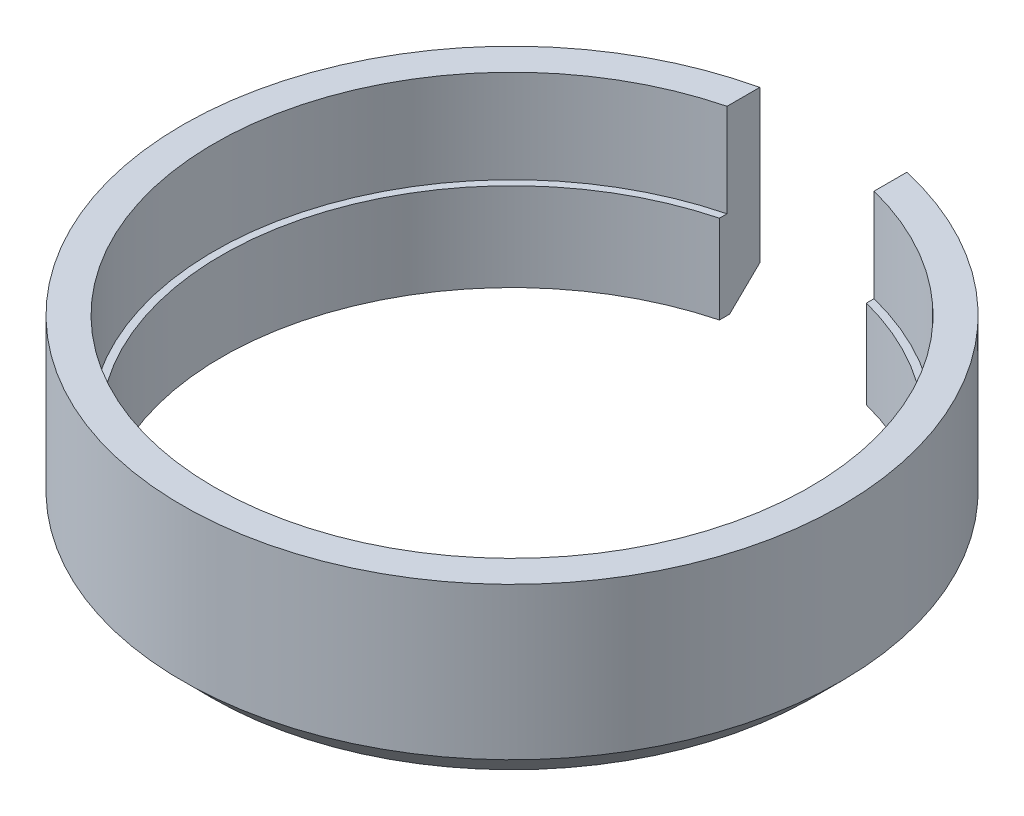
ISO-10303-21;
HEADER;
FILE_DESCRIPTION(('STEP AP214'),'2;1');
FILE_NAME('part.step','',(''),(''),'','','');
FILE_SCHEMA(('AUTOMOTIVE_DESIGN { 1 0 10303 214 1 1 1 1 }'));
ENDSEC;
DATA;
#1=APPLICATION_CONTEXT('core data for automotive mechanical design processes');
#2=APPLICATION_PROTOCOL_DEFINITION('international standard','automotive_design',2000,#1);
#3=PRODUCT_CONTEXT('',#1,'mechanical');
#4=PRODUCT('Part','Part','',(#3));
#5=PRODUCT_RELATED_PRODUCT_CATEGORY('part','',(#4));
#6=PRODUCT_DEFINITION_FORMATION('','',#4);
#7=PRODUCT_DEFINITION_CONTEXT('part definition',#1,'design');
#8=PRODUCT_DEFINITION('design','',#6,#7);
#9=PRODUCT_DEFINITION_SHAPE('','',#8);
#10=(LENGTH_UNIT() NAMED_UNIT(*) SI_UNIT(.MILLI.,.METRE.));
#11=(NAMED_UNIT(*) PLANE_ANGLE_UNIT() SI_UNIT($,.RADIAN.));
#12=(NAMED_UNIT(*) SI_UNIT($,.STERADIAN.) SOLID_ANGLE_UNIT());
#13=UNCERTAINTY_MEASURE_WITH_UNIT(LENGTH_MEASURE(1.E-05),#10,'distance_accuracy_value','');
#14=(GEOMETRIC_REPRESENTATION_CONTEXT(3) GLOBAL_UNCERTAINTY_ASSIGNED_CONTEXT((#13)) GLOBAL_UNIT_ASSIGNED_CONTEXT((#10,
#11,#12)) REPRESENTATION_CONTEXT('',''));
#15=CARTESIAN_POINT('',(0.,0.,0.));
#16=DIRECTION('',(0.,0.,1.));
#17=DIRECTION('',(1.,0.,0.));
#18=AXIS2_PLACEMENT_3D('',#15,#16,#17);
#19=CARTESIAN_POINT('',(0.,0.,0.));
#20=DIRECTION('',(0.,-1.,0.));
#21=DIRECTION('',(0.,0.,-1.));
#22=AXIS2_PLACEMENT_3D('',#19,#20,#21);
#23=CYLINDRICAL_SURFACE('',#22,11.85);
#24=CARTESIAN_POINT('',(0.,0.,0.));
#25=DIRECTION('',(0.,-1.,0.));
#26=DIRECTION('',(0.,0.,-1.));
#27=AXIS2_PLACEMENT_3D('',#24,#25,#26);
#28=CIRCLE('',#27,11.85);
#29=CARTESIAN_POINT('',(3.,0.,-11.4639652825713));
#30=VERTEX_POINT('',#29);
#31=CARTESIAN_POINT('',(-3.,0.,-11.4639652825713));
#32=VERTEX_POINT('',#31);
#33=EDGE_CURVE('E122',#30,#32,#28,.T.);
#34=ORIENTED_EDGE('',*,*,#33,.T.);
#35=DIRECTION('',(0.,-1.,0.));
#36=VECTOR('',#35,1.);
#37=CARTESIAN_POINT('',(-3.,0.,-11.4639652825713));
#38=LINE('',#37,#36);
#39=CARTESIAN_POINT('',(-3.,3.6,-11.4639652825713));
#40=VERTEX_POINT('',#39);
#41=EDGE_CURVE('E106',#40,#32,#38,.T.);
#42=ORIENTED_EDGE('',*,*,#41,.F.);
#43=CARTESIAN_POINT('',(0.,3.6,0.));
#44=DIRECTION('',(0.,-1.,0.));
#45=DIRECTION('',(0.,0.,-1.));
#46=AXIS2_PLACEMENT_3D('',#43,#44,#45);
#47=CIRCLE('',#46,11.85);
#48=CARTESIAN_POINT('',(3.,3.6,-11.4639652825713));
#49=VERTEX_POINT('',#48);
#50=EDGE_CURVE('E124',#49,#40,#47,.T.);
#51=ORIENTED_EDGE('',*,*,#50,.F.);
#52=DIRECTION('',(0.,-1.,0.));
#53=VECTOR('',#52,1.);
#54=CARTESIAN_POINT('',(3.,0.,-11.4639652825713));
#55=LINE('',#54,#53);
#56=EDGE_CURVE('E170',#30,#49,#55,.F.);
#57=ORIENTED_EDGE('',*,*,#56,.F.);
#58=EDGE_LOOP('',(#34,#42,#51,#57));
#59=FACE_BOUND('',#58,.T.);
#60=ADVANCED_FACE('F36',(#59),#23,.F.);
#61=CARTESIAN_POINT('',(-11.85,0.,0.));
#62=DIRECTION('',(0.,1.,0.));
#63=DIRECTION('',(0.,0.,1.));
#64=AXIS2_PLACEMENT_3D('',#61,#62,#63);
#65=PLANE('',#64);
#66=CARTESIAN_POINT('',(0.,0.,0.));
#67=DIRECTION('',(0.,1.,0.));
#68=DIRECTION('',(0.,0.,1.));
#69=AXIS2_PLACEMENT_3D('',#66,#67,#68);
#70=CIRCLE('',#69,12.25);
#71=CARTESIAN_POINT('',(3.,0.,-11.8769735202197));
#72=VERTEX_POINT('',#71);
#73=CARTESIAN_POINT('',(-3.,0.,-11.8769735202197));
#74=VERTEX_POINT('',#73);
#75=EDGE_CURVE('E45',#72,#74,#70,.F.);
#76=ORIENTED_EDGE('',*,*,#75,.T.);
#77=DIRECTION('',(0.,0.,-1.));
#78=VECTOR('',#77,1.);
#79=CARTESIAN_POINT('',(-3.,0.,-17.));
#80=LINE('',#79,#78);
#81=EDGE_CURVE('E52',#32,#74,#80,.T.);
#82=ORIENTED_EDGE('',*,*,#81,.F.);
#83=ORIENTED_EDGE('',*,*,#33,.F.);
#84=DIRECTION('',(0.,0.,1.));
#85=VECTOR('',#84,1.);
#86=CARTESIAN_POINT('',(3.,0.,-17.));
#87=LINE('',#86,#85);
#88=EDGE_CURVE('E135',#72,#30,#87,.T.);
#89=ORIENTED_EDGE('',*,*,#88,.F.);
#90=EDGE_LOOP('',(#76,#82,#83,#89));
#91=FACE_BOUND('',#90,.T.);
#92=ADVANCED_FACE('F133',(#91),#65,.F.);
#93=CARTESIAN_POINT('',(0.,0.,0.));
#94=DIRECTION('',(0.,-1.,0.));
#95=DIRECTION('',(0.,0.,-1.));
#96=AXIS2_PLACEMENT_3D('',#93,#94,#95);
#97=CYLINDRICAL_SURFACE('',#96,13.45);
#98=CARTESIAN_POINT('',(0.,7.4,0.));
#99=DIRECTION('',(0.,-1.,0.));
#100=DIRECTION('',(0.,0.,-1.));
#101=AXIS2_PLACEMENT_3D('',#98,#99,#100);
#102=CIRCLE('',#101,13.45);
#103=CARTESIAN_POINT('',(3.,7.4,-13.1111593690261));
#104=VERTEX_POINT('',#103);
#105=CARTESIAN_POINT('',(-3.,7.4,-13.1111593690261));
#106=VERTEX_POINT('',#105);
#107=EDGE_CURVE('E120',#104,#106,#102,.T.);
#108=ORIENTED_EDGE('',*,*,#107,.T.);
#109=DIRECTION('',(0.,-1.,0.));
#110=VECTOR('',#109,1.);
#111=CARTESIAN_POINT('',(-3.,0.,-13.1111593690261));
#112=LINE('',#111,#110);
#113=CARTESIAN_POINT('',(-3.,1.20000000000001,-13.1111593690261));
#114=VERTEX_POINT('',#113);
#115=EDGE_CURVE('E100',#114,#106,#112,.F.);
#116=ORIENTED_EDGE('',*,*,#115,.F.);
#117=CARTESIAN_POINT('',(0.,1.20000000000001,0.));
#118=DIRECTION('',(0.,1.,0.));
#119=DIRECTION('',(0.,0.,1.));
#120=AXIS2_PLACEMENT_3D('',#117,#118,#119);
#121=CIRCLE('',#120,13.45);
#122=CARTESIAN_POINT('',(3.,1.20000000000001,-13.1111593690261));
#123=VERTEX_POINT('',#122);
#124=EDGE_CURVE('E11',#114,#123,#121,.T.);
#125=ORIENTED_EDGE('',*,*,#124,.T.);
#126=DIRECTION('',(0.,-1.,0.));
#127=VECTOR('',#126,1.);
#128=CARTESIAN_POINT('',(3.,0.,-13.1111593690261));
#129=LINE('',#128,#127);
#130=EDGE_CURVE('E60',#104,#123,#129,.T.);
#131=ORIENTED_EDGE('',*,*,#130,.F.);
#132=EDGE_LOOP('',(#108,#116,#125,#131));
#133=FACE_BOUND('',#132,.T.);
#134=ADVANCED_FACE('F184',(#133),#97,.T.);
#135=CARTESIAN_POINT('',(-13.45,7.4,0.));
#136=DIRECTION('',(0.,-1.,0.));
#137=DIRECTION('',(0.,0.,-1.));
#138=AXIS2_PLACEMENT_3D('',#135,#136,#137);
#139=PLANE('',#138);
#140=CARTESIAN_POINT('',(0.,7.4,0.));
#141=DIRECTION('',(0.,-1.,0.));
#142=DIRECTION('',(0.,0.,-1.));
#143=AXIS2_PLACEMENT_3D('',#140,#141,#142);
#144=CIRCLE('',#143,12.15);
#145=CARTESIAN_POINT('',(3.,7.4,-11.7738056719142));
#146=VERTEX_POINT('',#145);
#147=CARTESIAN_POINT('',(-3.,7.4,-11.7738056719142));
#148=VERTEX_POINT('',#147);
#149=EDGE_CURVE('E113',#146,#148,#144,.T.);
#150=ORIENTED_EDGE('',*,*,#149,.T.);
#151=DIRECTION('',(0.,0.,1.));
#152=VECTOR('',#151,1.);
#153=CARTESIAN_POINT('',(-3.,7.4,-17.));
#154=LINE('',#153,#152);
#155=EDGE_CURVE('E94',#106,#148,#154,.T.);
#156=ORIENTED_EDGE('',*,*,#155,.F.);
#157=ORIENTED_EDGE('',*,*,#107,.F.);
#158=DIRECTION('',(0.,0.,-1.));
#159=VECTOR('',#158,1.);
#160=CARTESIAN_POINT('',(3.,7.4,-17.));
#161=LINE('',#160,#159);
#162=EDGE_CURVE('E105',#146,#104,#161,.T.);
#163=ORIENTED_EDGE('',*,*,#162,.F.);
#164=EDGE_LOOP('',(#150,#156,#157,#163));
#165=FACE_BOUND('',#164,.T.);
#166=ADVANCED_FACE('F119',(#165),#139,.F.);
#167=CARTESIAN_POINT('',(0.,0.,0.));
#168=DIRECTION('',(0.,-1.,0.));
#169=DIRECTION('',(0.,0.,-1.));
#170=AXIS2_PLACEMENT_3D('',#167,#168,#169);
#171=CYLINDRICAL_SURFACE('',#170,12.15);
#172=CARTESIAN_POINT('',(0.,3.6,0.));
#173=DIRECTION('',(0.,-1.,0.));
#174=DIRECTION('',(0.,0.,-1.));
#175=AXIS2_PLACEMENT_3D('',#172,#173,#174);
#176=CIRCLE('',#175,12.15);
#177=CARTESIAN_POINT('',(3.,3.6,-11.7738056719142));
#178=VERTEX_POINT('',#177);
#179=CARTESIAN_POINT('',(-3.,3.6,-11.7738056719142));
#180=VERTEX_POINT('',#179);
#181=EDGE_CURVE('E115',#178,#180,#176,.T.);
#182=ORIENTED_EDGE('',*,*,#181,.T.);
#183=DIRECTION('',(0.,-1.,0.));
#184=VECTOR('',#183,1.);
#185=CARTESIAN_POINT('',(-3.,0.,-11.7738056719142));
#186=LINE('',#185,#184);
#187=EDGE_CURVE('E97',#148,#180,#186,.T.);
#188=ORIENTED_EDGE('',*,*,#187,.F.);
#189=ORIENTED_EDGE('',*,*,#149,.F.);
#190=DIRECTION('',(0.,-1.,0.));
#191=VECTOR('',#190,1.);
#192=CARTESIAN_POINT('',(3.,0.,-11.7738056719142));
#193=LINE('',#192,#191);
#194=EDGE_CURVE('E116',#178,#146,#193,.F.);
#195=ORIENTED_EDGE('',*,*,#194,.F.);
#196=EDGE_LOOP('',(#182,#188,#189,#195));
#197=FACE_BOUND('',#196,.T.);
#198=ADVANCED_FACE('F111',(#197),#171,.F.);
#199=CARTESIAN_POINT('',(-12.15,3.6,0.));
#200=DIRECTION('',(0.,-1.,0.));
#201=DIRECTION('',(0.,0.,-1.));
#202=AXIS2_PLACEMENT_3D('',#199,#200,#201);
#203=PLANE('',#202);
#204=ORIENTED_EDGE('',*,*,#50,.T.);
#205=DIRECTION('',(0.,0.,1.));
#206=VECTOR('',#205,1.);
#207=CARTESIAN_POINT('',(-3.,3.6,-17.));
#208=LINE('',#207,#206);
#209=EDGE_CURVE('E140',#180,#40,#208,.T.);
#210=ORIENTED_EDGE('',*,*,#209,.F.);
#211=ORIENTED_EDGE('',*,*,#181,.F.);
#212=DIRECTION('',(0.,0.,-1.));
#213=VECTOR('',#212,1.);
#214=CARTESIAN_POINT('',(3.,3.6,-17.));
#215=LINE('',#214,#213);
#216=EDGE_CURVE('E172',#49,#178,#215,.T.);
#217=ORIENTED_EDGE('',*,*,#216,.F.);
#218=EDGE_LOOP('',(#204,#210,#211,#217));
#219=FACE_BOUND('',#218,.T.);
#220=ADVANCED_FACE('F177',(#219),#203,.F.);
#221=CARTESIAN_POINT('',(0.,0.,0.));
#222=DIRECTION('',(0.,1.,0.));
#223=DIRECTION('',(0.,0.,1.));
#224=AXIS2_PLACEMENT_3D('',#221,#222,#223);
#225=CONICAL_SURFACE('',#224,12.25,0.785398163397447);
#226=CARTESIAN_POINT('',(-3.,7.76087831858872,-19.7847226688009));
#227=CARTESIAN_POINT('',(-3.,7.15433547908863,-19.1712082115685));
#228=CARTESIAN_POINT('',(-3.,6.54807678089968,-18.5574119348734));
#229=CARTESIAN_POINT('',(-3.,5.33644086625651,-17.328979976287));
#230=CARTESIAN_POINT('',(-3.,4.73106362843047,-16.7143443154721));
#231=CARTESIAN_POINT('',(-3.,3.52157077953975,-15.484026150872));
#232=CARTESIAN_POINT('',(-3.,2.91745498188758,-14.8683438305783));
#233=CARTESIAN_POINT('',(-3.,1.71087313692222,-13.6353313539763));
#234=CARTESIAN_POINT('',(-3.,1.10840713335609,-13.0180011548127));
#235=CARTESIAN_POINT('',(-3.,0.206523737506687,-12.0900870193611));
#236=CARTESIAN_POINT('',(-3.,-0.0938397552153294,-11.7804227774043));
#237=CARTESIAN_POINT('',(-3.,-0.693764929996538,-11.1603202699505));
#238=CARTESIAN_POINT('',(-3.,-0.993326614791109,-10.8498820071012));
#239=CARTESIAN_POINT('',(-3.,-1.5914080504365,-10.2280413890297));
#240=CARTESIAN_POINT('',(-3.,-1.88992786709455,-9.9166390971317));
#241=CARTESIAN_POINT('',(-3.,-2.48563346809071,-9.2925522334624));
#242=CARTESIAN_POINT('',(-3.,-2.78281923509428,-8.97986764512948));
#243=CARTESIAN_POINT('',(-3.,-3.37546330702302,-8.35272013942462));
#244=CARTESIAN_POINT('',(-3.,-3.67092117344916,-8.03825680735985));
#245=CARTESIAN_POINT('',(-3.,-4.25933600465925,-7.40701357608694));
#246=CARTESIAN_POINT('',(-3.,-4.55229305867974,-7.09023376029314));
#247=CARTESIAN_POINT('',(-3.,-4.98904008299086,-6.61253804088603));
#248=CARTESIAN_POINT('',(-3.,-5.13419084857115,-6.45286665082569));
#249=CARTESIAN_POINT('',(-3.,-5.42336637260908,-6.13251020652481));
#250=CARTESIAN_POINT('',(-3.,-5.56739114467557,-5.97182516457789));
#251=CARTESIAN_POINT('',(-3.,-5.8540691820511,-5.64919888647862));
#252=CARTESIAN_POINT('',(-3.,-5.99672227989621,-5.48725750119622));
#253=CARTESIAN_POINT('',(-3.,-6.28024229194669,-5.16180795433086));
#254=CARTESIAN_POINT('',(-3.,-6.42110913118454,-4.9982997274914));
#255=CARTESIAN_POINT('',(-3.,-6.56087831858871,-4.8338499672522));
#256=B_SPLINE_CURVE_WITH_KNOTS('',3,(#226,#227,#228,#229,#230,#231,#232,#233,#234,#235,#236,
#237,#238,#239,#240,#241,#242,#243,#244,#245,#246,#247,#248,#249,#250,#251,#252,#253,#254,#255),
.UNSPECIFIED.,.F.,.F.,(4,2,2,2,2,2,2,2,2,2,2,2,2,2,4),(0.,2.58817553003681,5.17628722600698,
7.76398427901539,10.3517492972927,11.6459628685651,12.9401720189675,14.2342978879832,
15.5284405243777,16.8228984512286,18.1173099931995,18.7646644860358,19.4120111427664,
20.0594358536018,20.7068876468802),.UNSPECIFIED.);
#257=EDGE_CURVE('E139',#114,#74,#256,.T.);
#258=ORIENTED_EDGE('',*,*,#257,.T.);
#259=ORIENTED_EDGE('',*,*,#75,.F.);
#260=CARTESIAN_POINT('',(3.,-6.56087831858871,-4.8338499672522));
#261=CARTESIAN_POINT('',(3.,-6.47085952267105,-4.93978797847737));
#262=CARTESIAN_POINT('',(3.,-6.3803724154183,-5.04532592166465));
#263=CARTESIAN_POINT('',(3.,-6.19858972421589,-5.25570041885877));
#264=CARTESIAN_POINT('',(3.,-6.10729415378193,-5.36053698453983));
#265=CARTESIAN_POINT('',(3.,-5.83239440445547,-5.6741343482542));
#266=CARTESIAN_POINT('',(3.,-5.64776538916836,-5.88199663255198));
#267=CARTESIAN_POINT('',(3.,-5.27651130345427,-6.29586292175819));
#268=CARTESIAN_POINT('',(3.,-5.08988657476156,-6.50186723402139));
#269=CARTESIAN_POINT('',(3.,-4.71507681067657,-6.91245724044815));
#270=CARTESIAN_POINT('',(3.,-4.52689174544061,-7.11704290734002));
#271=CARTESIAN_POINT('',(3.,-3.96061529807523,-7.72903702184582));
#272=CARTESIAN_POINT('',(3.,-3.58071939197711,-8.13477473659902));
#273=CARTESIAN_POINT('',(3.,-2.81782773714488,-8.94335736600142));
#274=CARTESIAN_POINT('',(3.,-2.43483182197475,-9.34620212311007));
#275=CARTESIAN_POINT('',(3.,-1.6467634502529,-10.1707466546502));
#276=CARTESIAN_POINT('',(3.,-1.24157802758782,-10.592338385469));
#277=CARTESIAN_POINT('',(3.,-0.429563719582222,-11.4339361322105));
#278=CARTESIAN_POINT('',(3.,-0.0227348307636582,-11.8539421447737));
#279=CARTESIAN_POINT('',(3.,0.792116269528544,-12.6927814317495));
#280=CARTESIAN_POINT('',(3.,1.20013846187044,-13.1116147247553));
#281=CARTESIAN_POINT('',(3.,2.01708458328823,-13.9484010427036));
#282=CARTESIAN_POINT('',(3.,2.42600851286856,-14.3663540671534));
#283=CARTESIAN_POINT('',(3.,3.24469827124407,-15.2017291958751));
#284=CARTESIAN_POINT('',(3.,3.6544643498632,-15.6191510552487));
#285=CARTESIAN_POINT('',(3.,4.47454393758696,-16.4534569120264));
#286=CARTESIAN_POINT('',(3.,4.88485744691828,-16.8703409092075));
#287=CARTESIAN_POINT('',(3.,5.70591917043706,-17.7036754005482));
#288=CARTESIAN_POINT('',(3.,6.11666738189725,-18.1201258973952));
#289=CARTESIAN_POINT('',(3.,6.93852288191236,-18.9526716198035));
#290=CARTESIAN_POINT('',(3.,7.34963017010561,-19.3687668457218));
#291=CARTESIAN_POINT('',(3.,7.76087831858872,-19.7847226688009));
#292=B_SPLINE_CURVE_WITH_KNOTS('',3,(#260,#261,#262,#263,#264,#265,#266,#267,#268,#269,#270,
#271,#272,#273,#274,#275,#276,#277,#278,#279,#280,#281,#282,#283,#284,#285,#286,#287,#288,#289,
#290,#291),.UNSPECIFIED.,.F.,.F.,(4,2,2,2,2,2,2,2,2,2,2,2,2,2,2,4),(0.,0.417052776285289,
0.83409859348848,1.66813571999461,2.50203224764448,3.33594476172354,5.00339720740894,
6.67093977855349,8.42513752008973,10.1793389759605,11.9335124599598,13.6876869255046,
15.4424920507333,17.1972979028879,18.9520928101274,20.7068859519853),.UNSPECIFIED.);
#293=EDGE_CURVE('E138',#72,#123,#292,.T.);
#294=ORIENTED_EDGE('',*,*,#293,.T.);
#295=ORIENTED_EDGE('',*,*,#124,.F.);
#296=EDGE_LOOP('',(#258,#259,#294,#295));
#297=FACE_BOUND('',#296,.T.);
#298=ADVANCED_FACE('F39',(#297),#225,.T.);
#299=CARTESIAN_POINT('',(3.,-0.00100000000000013,-17.));
#300=DIRECTION('',(1.,0.,0.));
#301=DIRECTION('',(0.,0.,-1.));
#302=AXIS2_PLACEMENT_3D('',#299,#300,#301);
#303=PLANE('',#302);
#304=ORIENTED_EDGE('',*,*,#194,.T.);
#305=ORIENTED_EDGE('',*,*,#162,.T.);
#306=ORIENTED_EDGE('',*,*,#130,.T.);
#307=ORIENTED_EDGE('',*,*,#293,.F.);
#308=ORIENTED_EDGE('',*,*,#88,.T.);
#309=ORIENTED_EDGE('',*,*,#56,.T.);
#310=ORIENTED_EDGE('',*,*,#216,.T.);
#311=EDGE_LOOP('',(#304,#305,#306,#307,#308,#309,#310));
#312=FACE_BOUND('',#311,.T.);
#313=ADVANCED_FACE('F159',(#312),#303,.F.);
#314=CARTESIAN_POINT('',(-3.,-0.00100000000000013,-17.));
#315=DIRECTION('',(-1.,0.,0.));
#316=DIRECTION('',(0.,0.,1.));
#317=AXIS2_PLACEMENT_3D('',#314,#315,#316);
#318=PLANE('',#317);
#319=ORIENTED_EDGE('',*,*,#187,.T.);
#320=ORIENTED_EDGE('',*,*,#209,.T.);
#321=ORIENTED_EDGE('',*,*,#41,.T.);
#322=ORIENTED_EDGE('',*,*,#81,.T.);
#323=ORIENTED_EDGE('',*,*,#257,.F.);
#324=ORIENTED_EDGE('',*,*,#115,.T.);
#325=ORIENTED_EDGE('',*,*,#155,.T.);
#326=EDGE_LOOP('',(#319,#320,#321,#322,#323,#324,#325));
#327=FACE_BOUND('',#326,.T.);
#328=ADVANCED_FACE('F96',(#327),#318,.F.);
#329=CLOSED_SHELL('',(#60,#92,#134,#166,#198,#220,#298,#313,#328));
#330=MANIFOLD_SOLID_BREP('B2',#329);
#331=ADVANCED_BREP_SHAPE_REPRESENTATION('',(#18,#330),#14);
#332=SHAPE_DEFINITION_REPRESENTATION(#9,#331);
ENDSEC;
END-ISO-10303-21;
